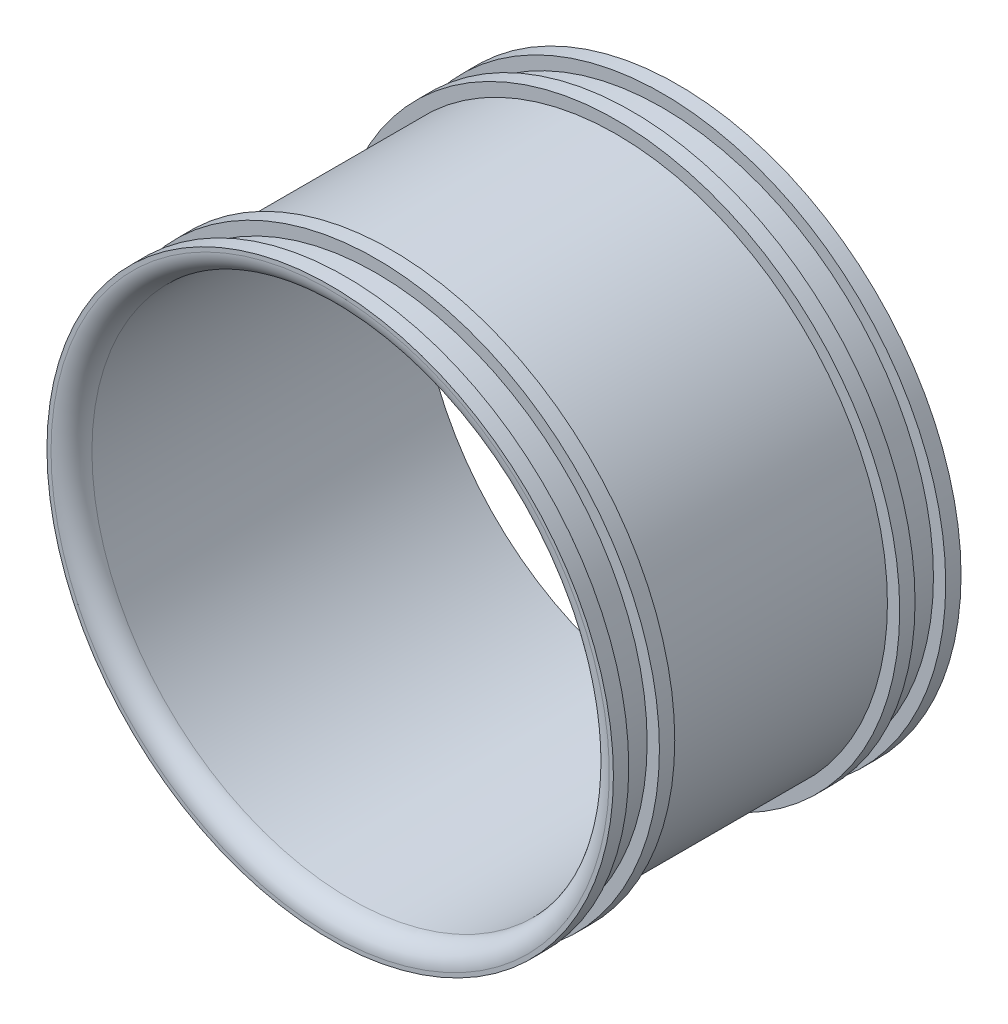
ISO-10303-21;
HEADER;
FILE_DESCRIPTION(('STEP AP214'),'2;1');
FILE_NAME('part.step','',(''),(''),'','','');
FILE_SCHEMA(('AUTOMOTIVE_DESIGN { 1 0 10303 214 1 1 1 1 }'));
ENDSEC;
DATA;
#1=APPLICATION_CONTEXT('core data for automotive mechanical design processes');
#2=APPLICATION_PROTOCOL_DEFINITION('international standard','automotive_design',2000,#1);
#3=PRODUCT_CONTEXT('',#1,'mechanical');
#4=PRODUCT('Part','Part','',(#3));
#5=PRODUCT_RELATED_PRODUCT_CATEGORY('part','',(#4));
#6=PRODUCT_DEFINITION_FORMATION('','',#4);
#7=PRODUCT_DEFINITION_CONTEXT('part definition',#1,'design');
#8=PRODUCT_DEFINITION('design','',#6,#7);
#9=PRODUCT_DEFINITION_SHAPE('','',#8);
#10=(LENGTH_UNIT() NAMED_UNIT(*) SI_UNIT(.MILLI.,.METRE.));
#11=(NAMED_UNIT(*) PLANE_ANGLE_UNIT() SI_UNIT($,.RADIAN.));
#12=(NAMED_UNIT(*) SI_UNIT($,.STERADIAN.) SOLID_ANGLE_UNIT());
#13=UNCERTAINTY_MEASURE_WITH_UNIT(LENGTH_MEASURE(1.E-05),#10,'distance_accuracy_value','');
#14=(GEOMETRIC_REPRESENTATION_CONTEXT(3) GLOBAL_UNCERTAINTY_ASSIGNED_CONTEXT((#13)) GLOBAL_UNIT_ASSIGNED_CONTEXT((#10,
#11,#12)) REPRESENTATION_CONTEXT('',''));
#15=CARTESIAN_POINT('',(0.,0.,0.));
#16=DIRECTION('',(0.,0.,1.));
#17=DIRECTION('',(1.,0.,0.));
#18=AXIS2_PLACEMENT_3D('',#15,#16,#17);
#19=CARTESIAN_POINT('',(27.3,0.,34.));
#20=DIRECTION('',(0.,0.,1.));
#21=DIRECTION('',(1.,0.,0.));
#22=AXIS2_PLACEMENT_3D('',#19,#20,#21);
#23=PLANE('',#22);
#24=CARTESIAN_POINT('',(0.,0.,34.));
#25=DIRECTION('',(0.,0.,-1.));
#26=DIRECTION('',(-1.,0.,0.));
#27=AXIS2_PLACEMENT_3D('',#24,#25,#26);
#28=CIRCLE('',#27,27.3);
#29=CARTESIAN_POINT('',(-27.3,0.,34.));
#30=VERTEX_POINT('',#29);
#31=EDGE_CURVE('E96',#30,#30,#28,.T.);
#32=ORIENTED_EDGE('',*,*,#31,.T.);
#33=EDGE_LOOP('',(#32));
#34=FACE_BOUND('',#33,.T.);
#35=CARTESIAN_POINT('',(0.,0.,34.));
#36=DIRECTION('',(0.,0.,-1.));
#37=DIRECTION('',(-1.,0.,0.));
#38=AXIS2_PLACEMENT_3D('',#35,#36,#37);
#39=CIRCLE('',#38,27.7);
#40=CARTESIAN_POINT('',(-27.7,0.,34.));
#41=VERTEX_POINT('',#40);
#42=EDGE_CURVE('E10',#41,#41,#39,.T.);
#43=ORIENTED_EDGE('',*,*,#42,.F.);
#44=EDGE_LOOP('',(#43));
#45=FACE_BOUND('',#44,.T.);
#46=ADVANCED_FACE('F41',(#34,#45),#23,.T.);
#47=CARTESIAN_POINT('',(0.,0.,34.));
#48=DIRECTION('',(0.,0.,-1.));
#49=DIRECTION('',(-1.,0.,0.));
#50=AXIS2_PLACEMENT_3D('',#47,#48,#49);
#51=CYLINDRICAL_SURFACE('',#50,27.7);
#52=ORIENTED_EDGE('',*,*,#42,.T.);
#53=EDGE_LOOP('',(#52));
#54=FACE_BOUND('',#53,.T.);
#55=CARTESIAN_POINT('',(0.,0.,32.5));
#56=DIRECTION('',(0.,0.,-1.));
#57=DIRECTION('',(-1.,0.,0.));
#58=AXIS2_PLACEMENT_3D('',#55,#56,#57);
#59=CIRCLE('',#58,27.7);
#60=CARTESIAN_POINT('',(-27.7,0.,32.5));
#61=VERTEX_POINT('',#60);
#62=EDGE_CURVE('E47',#61,#61,#59,.T.);
#63=ORIENTED_EDGE('',*,*,#62,.F.);
#64=EDGE_LOOP('',(#63));
#65=FACE_BOUND('',#64,.T.);
#66=ADVANCED_FACE('F114',(#54,#65),#51,.T.);
#67=CARTESIAN_POINT('',(26.5,0.,32.5));
#68=DIRECTION('',(0.,0.,-1.));
#69=DIRECTION('',(-1.,0.,0.));
#70=AXIS2_PLACEMENT_3D('',#67,#68,#69);
#71=PLANE('',#70);
#72=ORIENTED_EDGE('',*,*,#62,.T.);
#73=EDGE_LOOP('',(#72));
#74=FACE_BOUND('',#73,.T.);
#75=CARTESIAN_POINT('',(0.,0.,32.5));
#76=DIRECTION('',(0.,0.,-1.));
#77=DIRECTION('',(-1.,0.,0.));
#78=AXIS2_PLACEMENT_3D('',#75,#76,#77);
#79=CIRCLE('',#78,26.5);
#80=CARTESIAN_POINT('',(-26.5,0.,32.5));
#81=VERTEX_POINT('',#80);
#82=EDGE_CURVE('E51',#81,#81,#79,.T.);
#83=ORIENTED_EDGE('',*,*,#82,.F.);
#84=EDGE_LOOP('',(#83));
#85=FACE_BOUND('',#84,.T.);
#86=ADVANCED_FACE('F118',(#74,#85),#71,.T.);
#87=CARTESIAN_POINT('',(0.,0.,34.));
#88=DIRECTION('',(0.,0.,-1.));
#89=DIRECTION('',(-1.,0.,0.));
#90=AXIS2_PLACEMENT_3D('',#87,#88,#89);
#91=CYLINDRICAL_SURFACE('',#90,26.5);
#92=ORIENTED_EDGE('',*,*,#82,.T.);
#93=EDGE_LOOP('',(#92));
#94=FACE_BOUND('',#93,.T.);
#95=CARTESIAN_POINT('',(0.,0.,29.5));
#96=DIRECTION('',(0.,0.,-1.));
#97=DIRECTION('',(-1.,0.,0.));
#98=AXIS2_PLACEMENT_3D('',#95,#96,#97);
#99=CIRCLE('',#98,26.5);
#100=CARTESIAN_POINT('',(-26.5,0.,29.5));
#101=VERTEX_POINT('',#100);
#102=EDGE_CURVE('E55',#101,#101,#99,.T.);
#103=ORIENTED_EDGE('',*,*,#102,.F.);
#104=EDGE_LOOP('',(#103));
#105=FACE_BOUND('',#104,.T.);
#106=ADVANCED_FACE('F122',(#94,#105),#91,.T.);
#107=CARTESIAN_POINT('',(27.7,0.,29.5));
#108=DIRECTION('',(0.,0.,1.));
#109=DIRECTION('',(1.,0.,0.));
#110=AXIS2_PLACEMENT_3D('',#107,#108,#109);
#111=PLANE('',#110);
#112=ORIENTED_EDGE('',*,*,#102,.T.);
#113=EDGE_LOOP('',(#112));
#114=FACE_BOUND('',#113,.T.);
#115=CARTESIAN_POINT('',(0.,0.,29.5));
#116=DIRECTION('',(0.,0.,-1.));
#117=DIRECTION('',(-1.,0.,0.));
#118=AXIS2_PLACEMENT_3D('',#115,#116,#117);
#119=CIRCLE('',#118,27.7);
#120=CARTESIAN_POINT('',(-27.7,0.,29.5));
#121=VERTEX_POINT('',#120);
#122=EDGE_CURVE('E60',#121,#121,#119,.T.);
#123=ORIENTED_EDGE('',*,*,#122,.F.);
#124=EDGE_LOOP('',(#123));
#125=FACE_BOUND('',#124,.T.);
#126=ADVANCED_FACE('F128',(#114,#125),#111,.T.);
#127=CARTESIAN_POINT('',(0.,0.,34.));
#128=DIRECTION('',(0.,0.,-1.));
#129=DIRECTION('',(-1.,0.,0.));
#130=AXIS2_PLACEMENT_3D('',#127,#128,#129);
#131=CYLINDRICAL_SURFACE('',#130,27.7);
#132=ORIENTED_EDGE('',*,*,#122,.T.);
#133=EDGE_LOOP('',(#132));
#134=FACE_BOUND('',#133,.T.);
#135=CARTESIAN_POINT('',(0.,0.,28.));
#136=DIRECTION('',(0.,0.,-1.));
#137=DIRECTION('',(-1.,0.,0.));
#138=AXIS2_PLACEMENT_3D('',#135,#136,#137);
#139=CIRCLE('',#138,27.7);
#140=CARTESIAN_POINT('',(-27.7,0.,28.));
#141=VERTEX_POINT('',#140);
#142=EDGE_CURVE('E63',#141,#141,#139,.T.);
#143=ORIENTED_EDGE('',*,*,#142,.F.);
#144=EDGE_LOOP('',(#143));
#145=FACE_BOUND('',#144,.T.);
#146=ADVANCED_FACE('F132',(#134,#145),#131,.T.);
#147=CARTESIAN_POINT('',(26.5,0.,28.));
#148=DIRECTION('',(0.,0.,-1.));
#149=DIRECTION('',(-1.,0.,0.));
#150=AXIS2_PLACEMENT_3D('',#147,#148,#149);
#151=PLANE('',#150);
#152=ORIENTED_EDGE('',*,*,#142,.T.);
#153=EDGE_LOOP('',(#152));
#154=FACE_BOUND('',#153,.T.);
#155=CARTESIAN_POINT('',(0.,0.,28.));
#156=DIRECTION('',(0.,0.,-1.));
#157=DIRECTION('',(-1.,0.,0.));
#158=AXIS2_PLACEMENT_3D('',#155,#156,#157);
#159=CIRCLE('',#158,26.5);
#160=CARTESIAN_POINT('',(-26.5,0.,28.));
#161=VERTEX_POINT('',#160);
#162=EDGE_CURVE('E66',#161,#161,#159,.T.);
#163=ORIENTED_EDGE('',*,*,#162,.F.);
#164=EDGE_LOOP('',(#163));
#165=FACE_BOUND('',#164,.T.);
#166=ADVANCED_FACE('F136',(#154,#165),#151,.T.);
#167=CARTESIAN_POINT('',(0.,0.,34.));
#168=DIRECTION('',(0.,0.,-1.));
#169=DIRECTION('',(-1.,0.,0.));
#170=AXIS2_PLACEMENT_3D('',#167,#168,#169);
#171=CYLINDRICAL_SURFACE('',#170,26.5);
#172=ORIENTED_EDGE('',*,*,#162,.T.);
#173=EDGE_LOOP('',(#172));
#174=FACE_BOUND('',#173,.T.);
#175=CARTESIAN_POINT('',(0.,0.,6.));
#176=DIRECTION('',(0.,0.,-1.));
#177=DIRECTION('',(-1.,0.,0.));
#178=AXIS2_PLACEMENT_3D('',#175,#176,#177);
#179=CIRCLE('',#178,26.5);
#180=CARTESIAN_POINT('',(-26.5,0.,6.));
#181=VERTEX_POINT('',#180);
#182=EDGE_CURVE('E69',#181,#181,#179,.T.);
#183=ORIENTED_EDGE('',*,*,#182,.F.);
#184=EDGE_LOOP('',(#183));
#185=FACE_BOUND('',#184,.T.);
#186=ADVANCED_FACE('F140',(#174,#185),#171,.T.);
#187=CARTESIAN_POINT('',(27.7,0.,6.));
#188=DIRECTION('',(0.,0.,1.));
#189=DIRECTION('',(1.,0.,0.));
#190=AXIS2_PLACEMENT_3D('',#187,#188,#189);
#191=PLANE('',#190);
#192=ORIENTED_EDGE('',*,*,#182,.T.);
#193=EDGE_LOOP('',(#192));
#194=FACE_BOUND('',#193,.T.);
#195=CARTESIAN_POINT('',(0.,0.,6.));
#196=DIRECTION('',(0.,0.,-1.));
#197=DIRECTION('',(-1.,0.,0.));
#198=AXIS2_PLACEMENT_3D('',#195,#196,#197);
#199=CIRCLE('',#198,27.7);
#200=CARTESIAN_POINT('',(-27.7,0.,6.));
#201=VERTEX_POINT('',#200);
#202=EDGE_CURVE('E72',#201,#201,#199,.T.);
#203=ORIENTED_EDGE('',*,*,#202,.F.);
#204=EDGE_LOOP('',(#203));
#205=FACE_BOUND('',#204,.T.);
#206=ADVANCED_FACE('F144',(#194,#205),#191,.T.);
#207=CARTESIAN_POINT('',(0.,0.,34.));
#208=DIRECTION('',(0.,0.,-1.));
#209=DIRECTION('',(-1.,0.,0.));
#210=AXIS2_PLACEMENT_3D('',#207,#208,#209);
#211=CYLINDRICAL_SURFACE('',#210,27.7);
#212=ORIENTED_EDGE('',*,*,#202,.T.);
#213=EDGE_LOOP('',(#212));
#214=FACE_BOUND('',#213,.T.);
#215=CARTESIAN_POINT('',(0.,0.,4.5));
#216=DIRECTION('',(0.,0.,-1.));
#217=DIRECTION('',(-1.,0.,0.));
#218=AXIS2_PLACEMENT_3D('',#215,#216,#217);
#219=CIRCLE('',#218,27.7);
#220=CARTESIAN_POINT('',(-27.7,0.,4.5));
#221=VERTEX_POINT('',#220);
#222=EDGE_CURVE('E75',#221,#221,#219,.T.);
#223=ORIENTED_EDGE('',*,*,#222,.F.);
#224=EDGE_LOOP('',(#223));
#225=FACE_BOUND('',#224,.T.);
#226=ADVANCED_FACE('F148',(#214,#225),#211,.T.);
#227=CARTESIAN_POINT('',(26.5,0.,4.5));
#228=DIRECTION('',(0.,0.,-1.));
#229=DIRECTION('',(-1.,0.,0.));
#230=AXIS2_PLACEMENT_3D('',#227,#228,#229);
#231=PLANE('',#230);
#232=ORIENTED_EDGE('',*,*,#222,.T.);
#233=EDGE_LOOP('',(#232));
#234=FACE_BOUND('',#233,.T.);
#235=CARTESIAN_POINT('',(0.,0.,4.5));
#236=DIRECTION('',(0.,0.,-1.));
#237=DIRECTION('',(-1.,0.,0.));
#238=AXIS2_PLACEMENT_3D('',#235,#236,#237);
#239=CIRCLE('',#238,26.5);
#240=CARTESIAN_POINT('',(-26.5,0.,4.5));
#241=VERTEX_POINT('',#240);
#242=EDGE_CURVE('E78',#241,#241,#239,.T.);
#243=ORIENTED_EDGE('',*,*,#242,.F.);
#244=EDGE_LOOP('',(#243));
#245=FACE_BOUND('',#244,.T.);
#246=ADVANCED_FACE('F152',(#234,#245),#231,.T.);
#247=CARTESIAN_POINT('',(0.,0.,34.));
#248=DIRECTION('',(0.,0.,-1.));
#249=DIRECTION('',(-1.,0.,0.));
#250=AXIS2_PLACEMENT_3D('',#247,#248,#249);
#251=CYLINDRICAL_SURFACE('',#250,26.5);
#252=ORIENTED_EDGE('',*,*,#242,.T.);
#253=EDGE_LOOP('',(#252));
#254=FACE_BOUND('',#253,.T.);
#255=CARTESIAN_POINT('',(0.,0.,1.5));
#256=DIRECTION('',(0.,0.,-1.));
#257=DIRECTION('',(-1.,0.,0.));
#258=AXIS2_PLACEMENT_3D('',#255,#256,#257);
#259=CIRCLE('',#258,26.5);
#260=CARTESIAN_POINT('',(-26.5,0.,1.5));
#261=VERTEX_POINT('',#260);
#262=EDGE_CURVE('E81',#261,#261,#259,.T.);
#263=ORIENTED_EDGE('',*,*,#262,.F.);
#264=EDGE_LOOP('',(#263));
#265=FACE_BOUND('',#264,.T.);
#266=ADVANCED_FACE('F156',(#254,#265),#251,.T.);
#267=CARTESIAN_POINT('',(27.7,0.,1.5));
#268=DIRECTION('',(0.,0.,1.));
#269=DIRECTION('',(1.,0.,0.));
#270=AXIS2_PLACEMENT_3D('',#267,#268,#269);
#271=PLANE('',#270);
#272=ORIENTED_EDGE('',*,*,#262,.T.);
#273=EDGE_LOOP('',(#272));
#274=FACE_BOUND('',#273,.T.);
#275=CARTESIAN_POINT('',(0.,0.,1.5));
#276=DIRECTION('',(0.,0.,-1.));
#277=DIRECTION('',(-1.,0.,0.));
#278=AXIS2_PLACEMENT_3D('',#275,#276,#277);
#279=CIRCLE('',#278,27.7);
#280=CARTESIAN_POINT('',(-27.7,0.,1.5));
#281=VERTEX_POINT('',#280);
#282=EDGE_CURVE('E84',#281,#281,#279,.T.);
#283=ORIENTED_EDGE('',*,*,#282,.F.);
#284=EDGE_LOOP('',(#283));
#285=FACE_BOUND('',#284,.T.);
#286=ADVANCED_FACE('F160',(#274,#285),#271,.T.);
#287=CARTESIAN_POINT('',(0.,0.,34.));
#288=DIRECTION('',(0.,0.,-1.));
#289=DIRECTION('',(-1.,0.,0.));
#290=AXIS2_PLACEMENT_3D('',#287,#288,#289);
#291=CYLINDRICAL_SURFACE('',#290,27.7);
#292=ORIENTED_EDGE('',*,*,#282,.T.);
#293=EDGE_LOOP('',(#292));
#294=FACE_BOUND('',#293,.T.);
#295=CARTESIAN_POINT('',(0.,0.,0.));
#296=DIRECTION('',(0.,0.,-1.));
#297=DIRECTION('',(-1.,0.,0.));
#298=AXIS2_PLACEMENT_3D('',#295,#296,#297);
#299=CIRCLE('',#298,27.7);
#300=CARTESIAN_POINT('',(-27.7,0.,0.));
#301=VERTEX_POINT('',#300);
#302=EDGE_CURVE('E87',#301,#301,#299,.T.);
#303=ORIENTED_EDGE('',*,*,#302,.F.);
#304=EDGE_LOOP('',(#303));
#305=FACE_BOUND('',#304,.T.);
#306=ADVANCED_FACE('F164',(#294,#305),#291,.T.);
#307=CARTESIAN_POINT('',(25.3,0.,0.));
#308=DIRECTION('',(0.,0.,-1.));
#309=DIRECTION('',(-1.,0.,0.));
#310=AXIS2_PLACEMENT_3D('',#307,#308,#309);
#311=PLANE('',#310);
#312=ORIENTED_EDGE('',*,*,#302,.T.);
#313=EDGE_LOOP('',(#312));
#314=FACE_BOUND('',#313,.T.);
#315=CARTESIAN_POINT('',(0.,0.,0.));
#316=DIRECTION('',(0.,0.,-1.));
#317=DIRECTION('',(-1.,0.,0.));
#318=AXIS2_PLACEMENT_3D('',#315,#316,#317);
#319=CIRCLE('',#318,25.3);
#320=CARTESIAN_POINT('',(-25.3,0.,0.));
#321=VERTEX_POINT('',#320);
#322=EDGE_CURVE('E90',#321,#321,#319,.T.);
#323=ORIENTED_EDGE('',*,*,#322,.F.);
#324=EDGE_LOOP('',(#323));
#325=FACE_BOUND('',#324,.T.);
#326=ADVANCED_FACE('F110',(#314,#325),#311,.T.);
#327=CARTESIAN_POINT('',(0.,0.,34.));
#328=DIRECTION('',(0.,0.,-1.));
#329=DIRECTION('',(-1.,0.,0.));
#330=AXIS2_PLACEMENT_3D('',#327,#328,#329);
#331=CYLINDRICAL_SURFACE('',#330,25.3);
#332=ORIENTED_EDGE('',*,*,#322,.T.);
#333=EDGE_LOOP('',(#332));
#334=FACE_BOUND('',#333,.T.);
#335=CARTESIAN_POINT('',(0.,0.,32.));
#336=DIRECTION('',(0.,0.,-1.));
#337=DIRECTION('',(-1.,0.,0.));
#338=AXIS2_PLACEMENT_3D('',#335,#336,#337);
#339=CIRCLE('',#338,25.3);
#340=CARTESIAN_POINT('',(-25.3,0.,32.));
#341=VERTEX_POINT('',#340);
#342=EDGE_CURVE('E93',#341,#341,#339,.T.);
#343=ORIENTED_EDGE('',*,*,#342,.F.);
#344=EDGE_LOOP('',(#343));
#345=FACE_BOUND('',#344,.T.);
#346=ADVANCED_FACE('F104',(#334,#345),#331,.F.);
#347=CARTESIAN_POINT('',(0.,0.,32.));
#348=DIRECTION('',(0.,0.,-1.));
#349=DIRECTION('',(-1.,0.,0.));
#350=AXIS2_PLACEMENT_3D('',#347,#348,#349);
#351=TOROIDAL_SURFACE('',#350,27.3,2.);
#352=ORIENTED_EDGE('',*,*,#342,.T.);
#353=EDGE_LOOP('',(#352));
#354=FACE_BOUND('',#353,.T.);
#355=ORIENTED_EDGE('',*,*,#31,.F.);
#356=EDGE_LOOP('',(#355));
#357=FACE_BOUND('',#356,.T.);
#358=ADVANCED_FACE('F102',(#354,#357),#351,.T.);
#359=CLOSED_SHELL('',(#46,#66,#86,#106,#126,#146,#166,#186,#206,#226,#246,#266,#286,#306,#326,
#346,#358));
#360=MANIFOLD_SOLID_BREP('B2',#359);
#361=ADVANCED_BREP_SHAPE_REPRESENTATION('',(#18,#360),#14);
#362=SHAPE_DEFINITION_REPRESENTATION(#9,#361);
ENDSEC;
END-ISO-10303-21;
